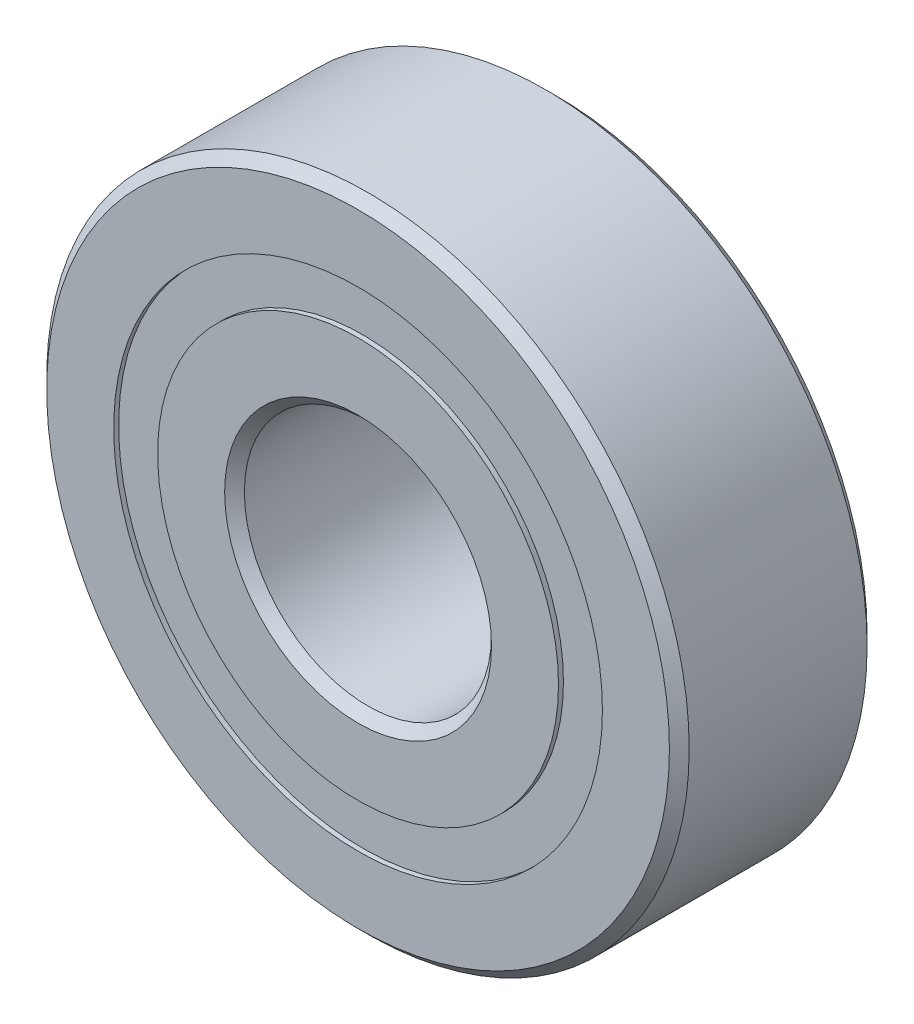
ISO-10303-21;
HEADER;
FILE_DESCRIPTION(('STEP AP214'),'2;1');
FILE_NAME('part.step','',(''),(''),'','','');
FILE_SCHEMA(('AUTOMOTIVE_DESIGN { 1 0 10303 214 1 1 1 1 }'));
ENDSEC;
DATA;
#1=APPLICATION_CONTEXT('core data for automotive mechanical design processes');
#2=APPLICATION_PROTOCOL_DEFINITION('international standard','automotive_design',2000,#1);
#3=PRODUCT_CONTEXT('',#1,'mechanical');
#4=PRODUCT('Part','Part','',(#3));
#5=PRODUCT_RELATED_PRODUCT_CATEGORY('part','',(#4));
#6=PRODUCT_DEFINITION_FORMATION('','',#4);
#7=PRODUCT_DEFINITION_CONTEXT('part definition',#1,'design');
#8=PRODUCT_DEFINITION('design','',#6,#7);
#9=PRODUCT_DEFINITION_SHAPE('','',#8);
#10=(LENGTH_UNIT() NAMED_UNIT(*) SI_UNIT(.MILLI.,.METRE.));
#11=(NAMED_UNIT(*) PLANE_ANGLE_UNIT() SI_UNIT($,.RADIAN.));
#12=(NAMED_UNIT(*) SI_UNIT($,.STERADIAN.) SOLID_ANGLE_UNIT());
#13=UNCERTAINTY_MEASURE_WITH_UNIT(LENGTH_MEASURE(1.E-05),#10,'distance_accuracy_value','');
#14=(GEOMETRIC_REPRESENTATION_CONTEXT(3) GLOBAL_UNCERTAINTY_ASSIGNED_CONTEXT((#13)) GLOBAL_UNIT_ASSIGNED_CONTEXT((#10,
#11,#12)) REPRESENTATION_CONTEXT('',''));
#15=CARTESIAN_POINT('',(0.,0.,0.));
#16=DIRECTION('',(0.,0.,1.));
#17=DIRECTION('',(1.,0.,0.));
#18=AXIS2_PLACEMENT_3D('',#15,#16,#17);
#19=CARTESIAN_POINT('',(0.,4.94444444444444,-0.993807989999908));
#20=DIRECTION('',(0.,0.,-1.));
#21=DIRECTION('',(-1.,0.,0.));
#22=AXIS2_PLACEMENT_3D('',#19,#20,#21);
#23=PLANE('',#22);
#24=CARTESIAN_POINT('',(0.,0.,-0.993807989999909));
#25=DIRECTION('',(0.,0.,1.));
#26=DIRECTION('',(1.,0.,0.));
#27=AXIS2_PLACEMENT_3D('',#24,#25,#26);
#28=CIRCLE('',#27,4.05555555555556);
#29=CARTESIAN_POINT('',(4.05555555555556,0.,-0.993807989999909));
#30=VERTEX_POINT('',#29);
#31=EDGE_CURVE('E11',#30,#30,#28,.T.);
#32=ORIENTED_EDGE('',*,*,#31,.F.);
#33=EDGE_LOOP('',(#32));
#34=FACE_BOUND('',#33,.T.);
#35=CARTESIAN_POINT('',(0.,0.,-0.993807989999908));
#36=DIRECTION('',(0.,0.,1.));
#37=DIRECTION('',(1.,0.,0.));
#38=AXIS2_PLACEMENT_3D('',#35,#36,#37);
#39=CIRCLE('',#38,4.94444444444444);
#40=CARTESIAN_POINT('',(4.94444444444444,0.,-0.993807989999908));
#41=VERTEX_POINT('',#40);
#42=EDGE_CURVE('E55',#41,#41,#39,.T.);
#43=ORIENTED_EDGE('',*,*,#42,.T.);
#44=EDGE_LOOP('',(#43));
#45=FACE_BOUND('',#44,.T.);
#46=ADVANCED_FACE('F41',(#34,#45),#23,.F.);
#47=CARTESIAN_POINT('',(0.,0.,2.));
#48=DIRECTION('',(0.,0.,1.));
#49=DIRECTION('',(1.,0.,0.));
#50=AXIS2_PLACEMENT_3D('',#47,#48,#49);
#51=CYLINDRICAL_SURFACE('',#50,4.05555555555556);
#52=CARTESIAN_POINT('',(0.,0.,-1.9));
#53=DIRECTION('',(0.,0.,1.));
#54=DIRECTION('',(1.,0.,0.));
#55=AXIS2_PLACEMENT_3D('',#52,#53,#54);
#56=CIRCLE('',#55,4.05555555555556);
#57=CARTESIAN_POINT('',(4.05555555555556,0.,-1.9));
#58=VERTEX_POINT('',#57);
#59=EDGE_CURVE('E47',#58,#58,#56,.T.);
#60=ORIENTED_EDGE('',*,*,#59,.F.);
#61=EDGE_LOOP('',(#60));
#62=FACE_BOUND('',#61,.T.);
#63=ORIENTED_EDGE('',*,*,#31,.T.);
#64=EDGE_LOOP('',(#63));
#65=FACE_BOUND('',#64,.T.);
#66=ADVANCED_FACE('F70',(#62,#65),#51,.F.);
#67=CARTESIAN_POINT('',(0.,4.94444444444444,-1.9));
#68=DIRECTION('',(0.,0.,1.));
#69=DIRECTION('',(1.,0.,0.));
#70=AXIS2_PLACEMENT_3D('',#67,#68,#69);
#71=PLANE('',#70);
#72=CARTESIAN_POINT('',(0.,0.,-1.9));
#73=DIRECTION('',(0.,0.,1.));
#74=DIRECTION('',(1.,0.,0.));
#75=AXIS2_PLACEMENT_3D('',#72,#73,#74);
#76=CIRCLE('',#75,4.94444444444444);
#77=CARTESIAN_POINT('',(4.94444444444444,0.,-1.9));
#78=VERTEX_POINT('',#77);
#79=EDGE_CURVE('E51',#78,#78,#76,.T.);
#80=ORIENTED_EDGE('',*,*,#79,.F.);
#81=EDGE_LOOP('',(#80));
#82=FACE_BOUND('',#81,.T.);
#83=ORIENTED_EDGE('',*,*,#59,.T.);
#84=EDGE_LOOP('',(#83));
#85=FACE_BOUND('',#84,.T.);
#86=ADVANCED_FACE('F65',(#82,#85),#71,.F.);
#87=CARTESIAN_POINT('',(0.,0.,2.));
#88=DIRECTION('',(0.,0.,1.));
#89=DIRECTION('',(1.,0.,0.));
#90=AXIS2_PLACEMENT_3D('',#87,#88,#89);
#91=CYLINDRICAL_SURFACE('',#90,4.94444444444444);
#92=ORIENTED_EDGE('',*,*,#42,.F.);
#93=EDGE_LOOP('',(#92));
#94=FACE_BOUND('',#93,.T.);
#95=ORIENTED_EDGE('',*,*,#79,.T.);
#96=EDGE_LOOP('',(#95));
#97=FACE_BOUND('',#96,.T.);
#98=ADVANCED_FACE('F62',(#94,#97),#91,.T.);
#99=CLOSED_SHELL('',(#46,#66,#86,#98));
#100=MANIFOLD_SOLID_BREP('B2',#99);
#101=CARTESIAN_POINT('',(0.,4.94444444444444,1.9));
#102=DIRECTION('',(0.,0.,-1.));
#103=DIRECTION('',(-1.,0.,0.));
#104=AXIS2_PLACEMENT_3D('',#101,#102,#103);
#105=PLANE('',#104);
#106=CARTESIAN_POINT('',(0.,0.,1.9));
#107=DIRECTION('',(0.,0.,1.));
#108=DIRECTION('',(1.,0.,0.));
#109=AXIS2_PLACEMENT_3D('',#106,#107,#108);
#110=CIRCLE('',#109,4.05555555555556);
#111=CARTESIAN_POINT('',(4.05555555555556,0.,1.9));
#112=VERTEX_POINT('',#111);
#113=EDGE_CURVE('E40',#112,#112,#110,.T.);
#114=ORIENTED_EDGE('',*,*,#113,.F.);
#115=EDGE_LOOP('',(#114));
#116=FACE_BOUND('',#115,.T.);
#117=CARTESIAN_POINT('',(0.,0.,1.9));
#118=DIRECTION('',(0.,0.,1.));
#119=DIRECTION('',(1.,0.,0.));
#120=AXIS2_PLACEMENT_3D('',#117,#118,#119);
#121=CIRCLE('',#120,4.94444444444444);
#122=CARTESIAN_POINT('',(4.94444444444444,0.,1.9));
#123=VERTEX_POINT('',#122);
#124=EDGE_CURVE('E122',#123,#123,#121,.T.);
#125=ORIENTED_EDGE('',*,*,#124,.T.);
#126=EDGE_LOOP('',(#125));
#127=FACE_BOUND('',#126,.T.);
#128=ADVANCED_FACE('F108',(#116,#127),#105,.F.);
#129=CARTESIAN_POINT('',(0.,0.,2.));
#130=DIRECTION('',(0.,0.,1.));
#131=DIRECTION('',(1.,0.,0.));
#132=AXIS2_PLACEMENT_3D('',#129,#130,#131);
#133=CYLINDRICAL_SURFACE('',#132,4.05555555555556);
#134=CARTESIAN_POINT('',(0.,0.,0.993807989999903));
#135=DIRECTION('',(0.,0.,1.));
#136=DIRECTION('',(1.,0.,0.));
#137=AXIS2_PLACEMENT_3D('',#134,#135,#136);
#138=CIRCLE('',#137,4.05555555555556);
#139=CARTESIAN_POINT('',(4.05555555555556,0.,0.993807989999903));
#140=VERTEX_POINT('',#139);
#141=EDGE_CURVE('E114',#140,#140,#138,.T.);
#142=ORIENTED_EDGE('',*,*,#141,.F.);
#143=EDGE_LOOP('',(#142));
#144=FACE_BOUND('',#143,.T.);
#145=ORIENTED_EDGE('',*,*,#113,.T.);
#146=EDGE_LOOP('',(#145));
#147=FACE_BOUND('',#146,.T.);
#148=ADVANCED_FACE('F137',(#144,#147),#133,.F.);
#149=CARTESIAN_POINT('',(0.,4.94444444444444,0.993807989999903));
#150=DIRECTION('',(0.,0.,1.));
#151=DIRECTION('',(1.,0.,0.));
#152=AXIS2_PLACEMENT_3D('',#149,#150,#151);
#153=PLANE('',#152);
#154=CARTESIAN_POINT('',(0.,0.,0.993807989999903));
#155=DIRECTION('',(0.,0.,1.));
#156=DIRECTION('',(1.,0.,0.));
#157=AXIS2_PLACEMENT_3D('',#154,#155,#156);
#158=CIRCLE('',#157,4.94444444444444);
#159=CARTESIAN_POINT('',(4.94444444444444,0.,0.993807989999903));
#160=VERTEX_POINT('',#159);
#161=EDGE_CURVE('E118',#160,#160,#158,.T.);
#162=ORIENTED_EDGE('',*,*,#161,.F.);
#163=EDGE_LOOP('',(#162));
#164=FACE_BOUND('',#163,.T.);
#165=ORIENTED_EDGE('',*,*,#141,.T.);
#166=EDGE_LOOP('',(#165));
#167=FACE_BOUND('',#166,.T.);
#168=ADVANCED_FACE('F132',(#164,#167),#153,.F.);
#169=CARTESIAN_POINT('',(0.,0.,2.));
#170=DIRECTION('',(0.,0.,1.));
#171=DIRECTION('',(1.,0.,0.));
#172=AXIS2_PLACEMENT_3D('',#169,#170,#171);
#173=CYLINDRICAL_SURFACE('',#172,4.94444444444444);
#174=ORIENTED_EDGE('',*,*,#124,.F.);
#175=EDGE_LOOP('',(#174));
#176=FACE_BOUND('',#175,.T.);
#177=ORIENTED_EDGE('',*,*,#161,.T.);
#178=EDGE_LOOP('',(#177));
#179=FACE_BOUND('',#178,.T.);
#180=ADVANCED_FACE('F129',(#176,#179),#173,.T.);
#181=CLOSED_SHELL('',(#128,#148,#168,#180));
#182=MANIFOLD_SOLID_BREP('B6',#181);
#183=CARTESIAN_POINT('',(-2.09125427419691,3.98455211543947,0.));
#184=DIRECTION('',(0.,0.,1.));
#185=DIRECTION('',(-0.464723172043757,0.885456025653216,0.));
#186=AXIS2_PLACEMENT_3D('',#183,#184,#185);
#187=SPHERICAL_SURFACE('',#186,0.993807989999902);
#188=CARTESIAN_POINT('',(-2.09125427419691,3.98455211543947,0.993807989999898));
#189=VERTEX_POINT('',#188);
#190=VERTEX_LOOP('',#189);
#191=FACE_BOUND('',#190,.T.);
#192=ADVANCED_FACE('F175',(#191),#187,.T.);
#193=CLOSED_SHELL('',(#192));
#194=MANIFOLD_SOLID_BREP('B35',#193);
#195=CARTESIAN_POINT('',(-3.70342739652142,2.55629136029025,0.));
#196=DIRECTION('',(0.,0.,1.));
#197=DIRECTION('',(-0.822983865893649,0.568064746731166,0.));
#198=AXIS2_PLACEMENT_3D('',#195,#196,#197);
#199=SPHERICAL_SURFACE('',#198,0.993807989999902);
#200=CARTESIAN_POINT('',(-3.70342739652142,2.55629136029025,0.993807989999898));
#201=VERTEX_POINT('',#200);
#202=VERTEX_LOOP('',#201);
#203=FACE_BOUND('',#202,.T.);
#204=ADVANCED_FACE('F206',(#203),#199,.T.);
#205=CLOSED_SHELL('',(#204));
#206=MANIFOLD_SOLID_BREP('B104',#205);
#207=CARTESIAN_POINT('',(-4.46718993344124,0.542415061149002,0.));
#208=DIRECTION('',(0.,0.,1.));
#209=DIRECTION('',(-0.992708874098053,0.120536680255334,0.));
#210=AXIS2_PLACEMENT_3D('',#207,#208,#209);
#211=SPHERICAL_SURFACE('',#210,0.993807989999902);
#212=CARTESIAN_POINT('',(-4.46718993344124,0.542415061149002,0.993807989999898));
#213=VERTEX_POINT('',#212);
#214=VERTEX_LOOP('',#213);
#215=FACE_BOUND('',#214,.T.);
#216=ADVANCED_FACE('F237',(#215),#211,.T.);
#217=CLOSED_SHELL('',(#216));
#218=MANIFOLD_SOLID_BREP('B171',#217);
#219=CARTESIAN_POINT('',(-4.20757309208438,-1.59572199169137,0.));
#220=DIRECTION('',(0.,0.,1.));
#221=DIRECTION('',(-0.935016242685418,-0.354604887042527,0.));
#222=AXIS2_PLACEMENT_3D('',#219,#220,#221);
#223=SPHERICAL_SURFACE('',#222,0.993807989999902);
#224=CARTESIAN_POINT('',(-4.20757309208438,-1.59572199169137,0.993807989999898));
#225=VERTEX_POINT('',#224);
#226=VERTEX_LOOP('',#225);
#227=FACE_BOUND('',#226,.T.);
#228=ADVANCED_FACE('F268',(#227),#223,.T.);
#229=CLOSED_SHELL('',(#228));
#230=MANIFOLD_SOLID_BREP('B202',#229);
#231=CARTESIAN_POINT('',(-2.98405196208361,-3.36829836676993,0.));
#232=DIRECTION('',(0.,0.,1.));
#233=DIRECTION('',(-0.663122658240802,-0.748510748171095,0.));
#234=AXIS2_PLACEMENT_3D('',#231,#232,#233);
#235=SPHERICAL_SURFACE('',#234,0.993807989999902);
#236=CARTESIAN_POINT('',(-2.98405196208361,-3.36829836676993,0.993807989999898));
#237=VERTEX_POINT('',#236);
#238=VERTEX_LOOP('',#237);
#239=FACE_BOUND('',#238,.T.);
#240=ADVANCED_FACE('F299',(#239),#235,.T.);
#241=CLOSED_SHELL('',(#240));
#242=MANIFOLD_SOLID_BREP('B233',#241);
#243=CARTESIAN_POINT('',(-1.07692048929404,-4.36923817841723,0.));
#244=DIRECTION('',(0.,0.,1.));
#245=DIRECTION('',(-0.239315664287565,-0.97094181742605,0.));
#246=AXIS2_PLACEMENT_3D('',#243,#244,#245);
#247=SPHERICAL_SURFACE('',#246,0.993807989999902);
#248=CARTESIAN_POINT('',(-1.07692048929404,-4.36923817841723,0.993807989999898));
#249=VERTEX_POINT('',#248);
#250=VERTEX_LOOP('',#249);
#251=FACE_BOUND('',#250,.T.);
#252=ADVANCED_FACE('F330',(#251),#247,.T.);
#253=CLOSED_SHELL('',(#252));
#254=MANIFOLD_SOLID_BREP('B264',#253);
#255=CARTESIAN_POINT('',(1.07692048929398,-4.36923817841724,0.));
#256=DIRECTION('',(0.,0.,1.));
#257=DIRECTION('',(0.239315664287552,-0.970941817426054,0.));
#258=AXIS2_PLACEMENT_3D('',#255,#256,#257);
#259=SPHERICAL_SURFACE('',#258,0.993807989999902);
#260=CARTESIAN_POINT('',(1.07692048929398,-4.36923817841724,0.993807989999898));
#261=VERTEX_POINT('',#260);
#262=VERTEX_LOOP('',#261);
#263=FACE_BOUND('',#262,.T.);
#264=ADVANCED_FACE('F361',(#263),#259,.T.);
#265=CLOSED_SHELL('',(#264));
#266=MANIFOLD_SOLID_BREP('B295',#265);
#267=CARTESIAN_POINT('',(2.98405196208356,-3.36829836676997,0.));
#268=DIRECTION('',(0.,0.,1.));
#269=DIRECTION('',(0.663122658240791,-0.748510748171105,0.));
#270=AXIS2_PLACEMENT_3D('',#267,#268,#269);
#271=SPHERICAL_SURFACE('',#270,0.993807989999902);
#272=CARTESIAN_POINT('',(2.98405196208356,-3.36829836676997,0.993807989999898));
#273=VERTEX_POINT('',#272);
#274=VERTEX_LOOP('',#273);
#275=FACE_BOUND('',#274,.T.);
#276=ADVANCED_FACE('F392',(#275),#271,.T.);
#277=CLOSED_SHELL('',(#276));
#278=MANIFOLD_SOLID_BREP('B326',#277);
#279=CARTESIAN_POINT('',(4.20757309208436,-1.59572199169143,0.));
#280=DIRECTION('',(0.,0.,1.));
#281=DIRECTION('',(0.935016242685413,-0.35460488704254,0.));
#282=AXIS2_PLACEMENT_3D('',#279,#280,#281);
#283=SPHERICAL_SURFACE('',#282,0.993807989999902);
#284=CARTESIAN_POINT('',(4.20757309208436,-1.59572199169143,0.993807989999898));
#285=VERTEX_POINT('',#284);
#286=VERTEX_LOOP('',#285);
#287=FACE_BOUND('',#286,.T.);
#288=ADVANCED_FACE('F423',(#287),#283,.T.);
#289=CLOSED_SHELL('',(#288));
#290=MANIFOLD_SOLID_BREP('B357',#289);
#291=CARTESIAN_POINT('',(4.46718993344125,0.54241506114894,0.));
#292=DIRECTION('',(0.,0.,1.));
#293=DIRECTION('',(0.992708874098054,0.12053668025532,0.));
#294=AXIS2_PLACEMENT_3D('',#291,#292,#293);
#295=SPHERICAL_SURFACE('',#294,0.993807989999902);
#296=CARTESIAN_POINT('',(4.46718993344125,0.54241506114894,0.993807989999898));
#297=VERTEX_POINT('',#296);
#298=VERTEX_LOOP('',#297);
#299=FACE_BOUND('',#298,.T.);
#300=ADVANCED_FACE('F454',(#299),#295,.T.);
#301=CLOSED_SHELL('',(#300));
#302=MANIFOLD_SOLID_BREP('B388',#301);
#303=CARTESIAN_POINT('',(3.70342739652146,2.55629136029019,0.));
#304=DIRECTION('',(0.,0.,1.));
#305=DIRECTION('',(0.822983865893658,0.568064746731154,0.));
#306=AXIS2_PLACEMENT_3D('',#303,#304,#305);
#307=SPHERICAL_SURFACE('',#306,0.993807989999902);
#308=CARTESIAN_POINT('',(3.70342739652146,2.55629136029019,0.993807989999898));
#309=VERTEX_POINT('',#308);
#310=VERTEX_LOOP('',#309);
#311=FACE_BOUND('',#310,.T.);
#312=ADVANCED_FACE('F485',(#311),#307,.T.);
#313=CLOSED_SHELL('',(#312));
#314=MANIFOLD_SOLID_BREP('B419',#313);
#315=CARTESIAN_POINT('',(2.09125427419696,3.98455211543944,0.));
#316=DIRECTION('',(0.,0.,1.));
#317=DIRECTION('',(0.46472317204377,0.885456025653209,0.));
#318=AXIS2_PLACEMENT_3D('',#315,#316,#317);
#319=SPHERICAL_SURFACE('',#318,0.993807989999902);
#320=CARTESIAN_POINT('',(2.09125427419696,3.98455211543944,0.993807989999898));
#321=VERTEX_POINT('',#320);
#322=VERTEX_LOOP('',#321);
#323=FACE_BOUND('',#322,.T.);
#324=ADVANCED_FACE('F516',(#323),#319,.T.);
#325=CLOSED_SHELL('',(#324));
#326=MANIFOLD_SOLID_BREP('B450',#325);
#327=CARTESIAN_POINT('',(0.,4.5,0.));
#328=DIRECTION('',(0.,0.,1.));
#329=DIRECTION('',(0.,1.,0.));
#330=AXIS2_PLACEMENT_3D('',#327,#328,#329);
#331=SPHERICAL_SURFACE('',#330,0.993807989999902);
#332=CARTESIAN_POINT('',(0.,4.5,0.993807989999898));
#333=VERTEX_POINT('',#332);
#334=VERTEX_LOOP('',#333);
#335=FACE_BOUND('',#334,.T.);
#336=ADVANCED_FACE('F549',(#335),#331,.T.);
#337=CLOSED_SHELL('',(#336));
#338=MANIFOLD_SOLID_BREP('B481',#337);
#339=CARTESIAN_POINT('',(0.,4.05555555555556,2.));
#340=DIRECTION('',(0.,0.,-1.));
#341=DIRECTION('',(-1.,0.,0.));
#342=AXIS2_PLACEMENT_3D('',#339,#340,#341);
#343=PLANE('',#342);
#344=CARTESIAN_POINT('',(0.,0.,2.));
#345=DIRECTION('',(0.,0.,1.));
#346=DIRECTION('',(1.,0.,0.));
#347=AXIS2_PLACEMENT_3D('',#344,#345,#346);
#348=CIRCLE('',#347,2.7);
#349=CARTESIAN_POINT('',(2.7,0.,2.));
#350=VERTEX_POINT('',#349);
#351=EDGE_CURVE('E548',#350,#350,#348,.T.);
#352=ORIENTED_EDGE('',*,*,#351,.F.);
#353=EDGE_LOOP('',(#352));
#354=FACE_BOUND('',#353,.T.);
#355=CARTESIAN_POINT('',(0.,0.,2.));
#356=DIRECTION('',(0.,0.,1.));
#357=DIRECTION('',(1.,0.,0.));
#358=AXIS2_PLACEMENT_3D('',#355,#356,#357);
#359=CIRCLE('',#358,4.05555555555556);
#360=CARTESIAN_POINT('',(4.05555555555556,0.,2.));
#361=VERTEX_POINT('',#360);
#362=EDGE_CURVE('E596',#361,#361,#359,.T.);
#363=ORIENTED_EDGE('',*,*,#362,.T.);
#364=EDGE_LOOP('',(#363));
#365=FACE_BOUND('',#364,.T.);
#366=ADVANCED_FACE('F568',(#354,#365),#343,.F.);
#367=CARTESIAN_POINT('',(0.,0.,2.));
#368=DIRECTION('',(0.,0.,1.));
#369=DIRECTION('',(1.,0.,0.));
#370=AXIS2_PLACEMENT_3D('',#367,#368,#369);
#371=CONICAL_SURFACE('',#370,2.7,0.785398163397448);
#372=CARTESIAN_POINT('',(0.,0.,1.8));
#373=DIRECTION('',(0.,0.,1.));
#374=DIRECTION('',(1.,0.,0.));
#375=AXIS2_PLACEMENT_3D('',#372,#373,#374);
#376=CIRCLE('',#375,2.5);
#377=CARTESIAN_POINT('',(2.5,0.,1.8));
#378=VERTEX_POINT('',#377);
#379=EDGE_CURVE('E574',#378,#378,#376,.T.);
#380=ORIENTED_EDGE('',*,*,#379,.F.);
#381=EDGE_LOOP('',(#380));
#382=FACE_BOUND('',#381,.T.);
#383=ORIENTED_EDGE('',*,*,#351,.T.);
#384=EDGE_LOOP('',(#383));
#385=FACE_BOUND('',#384,.T.);
#386=ADVANCED_FACE('F633',(#382,#385),#371,.F.);
#387=CARTESIAN_POINT('',(0.,0.,2.));
#388=DIRECTION('',(0.,0.,1.));
#389=DIRECTION('',(1.,0.,0.));
#390=AXIS2_PLACEMENT_3D('',#387,#388,#389);
#391=CYLINDRICAL_SURFACE('',#390,2.5);
#392=CARTESIAN_POINT('',(0.,0.,-1.8));
#393=DIRECTION('',(0.,0.,1.));
#394=DIRECTION('',(1.,0.,0.));
#395=AXIS2_PLACEMENT_3D('',#392,#393,#394);
#396=CIRCLE('',#395,2.5);
#397=CARTESIAN_POINT('',(2.5,0.,-1.8));
#398=VERTEX_POINT('',#397);
#399=EDGE_CURVE('E578',#398,#398,#396,.T.);
#400=ORIENTED_EDGE('',*,*,#399,.F.);
#401=EDGE_LOOP('',(#400));
#402=FACE_BOUND('',#401,.T.);
#403=ORIENTED_EDGE('',*,*,#379,.T.);
#404=EDGE_LOOP('',(#403));
#405=FACE_BOUND('',#404,.T.);
#406=ADVANCED_FACE('F628',(#402,#405),#391,.F.);
#407=CARTESIAN_POINT('',(0.,0.,-1.8));
#408=DIRECTION('',(0.,0.,-1.));
#409=DIRECTION('',(-1.,0.,0.));
#410=AXIS2_PLACEMENT_3D('',#407,#408,#409);
#411=CONICAL_SURFACE('',#410,2.5,0.785398163397448);
#412=CARTESIAN_POINT('',(0.,0.,-2.));
#413=DIRECTION('',(0.,0.,1.));
#414=DIRECTION('',(1.,0.,0.));
#415=AXIS2_PLACEMENT_3D('',#412,#413,#414);
#416=CIRCLE('',#415,2.7);
#417=CARTESIAN_POINT('',(2.7,0.,-2.));
#418=VERTEX_POINT('',#417);
#419=EDGE_CURVE('E582',#418,#418,#416,.T.);
#420=ORIENTED_EDGE('',*,*,#419,.F.);
#421=EDGE_LOOP('',(#420));
#422=FACE_BOUND('',#421,.T.);
#423=ORIENTED_EDGE('',*,*,#399,.T.);
#424=EDGE_LOOP('',(#423));
#425=FACE_BOUND('',#424,.T.);
#426=ADVANCED_FACE('F622',(#422,#425),#411,.F.);
#427=CARTESIAN_POINT('',(0.,4.05555555555556,-2.));
#428=DIRECTION('',(0.,0.,1.));
#429=DIRECTION('',(1.,0.,0.));
#430=AXIS2_PLACEMENT_3D('',#427,#428,#429);
#431=PLANE('',#430);
#432=CARTESIAN_POINT('',(0.,0.,-2.00000000000001));
#433=DIRECTION('',(0.,0.,1.));
#434=DIRECTION('',(1.,0.,0.));
#435=AXIS2_PLACEMENT_3D('',#432,#433,#434);
#436=CIRCLE('',#435,4.05555555555556);
#437=CARTESIAN_POINT('',(4.05555555555556,0.,-2.00000000000001));
#438=VERTEX_POINT('',#437);
#439=EDGE_CURVE('E587',#438,#438,#436,.T.);
#440=ORIENTED_EDGE('',*,*,#439,.F.);
#441=EDGE_LOOP('',(#440));
#442=FACE_BOUND('',#441,.T.);
#443=ORIENTED_EDGE('',*,*,#419,.T.);
#444=EDGE_LOOP('',(#443));
#445=FACE_BOUND('',#444,.T.);
#446=ADVANCED_FACE('F616',(#442,#445),#431,.F.);
#447=CARTESIAN_POINT('',(0.,0.,2.));
#448=DIRECTION('',(0.,0.,1.));
#449=DIRECTION('',(1.,0.,0.));
#450=AXIS2_PLACEMENT_3D('',#447,#448,#449);
#451=CYLINDRICAL_SURFACE('',#450,4.05555555555556);
#452=CARTESIAN_POINT('',(0.,0.,-0.88888888888889));
#453=DIRECTION('',(0.,0.,1.));
#454=DIRECTION('',(1.,0.,0.));
#455=AXIS2_PLACEMENT_3D('',#452,#453,#454);
#456=CIRCLE('',#455,4.05555555555556);
#457=CARTESIAN_POINT('',(4.05555555555556,0.,-0.88888888888889));
#458=VERTEX_POINT('',#457);
#459=EDGE_CURVE('E590',#458,#458,#456,.T.);
#460=ORIENTED_EDGE('',*,*,#459,.F.);
#461=EDGE_LOOP('',(#460));
#462=FACE_BOUND('',#461,.T.);
#463=ORIENTED_EDGE('',*,*,#439,.T.);
#464=EDGE_LOOP('',(#463));
#465=FACE_BOUND('',#464,.T.);
#466=ADVANCED_FACE('F610',(#462,#465),#451,.T.);
#467=CARTESIAN_POINT('',(0.,0.,0.));
#468=DIRECTION('',(0.,0.,1.));
#469=DIRECTION('',(1.,0.,0.));
#470=AXIS2_PLACEMENT_3D('',#467,#468,#469);
#471=TOROIDAL_SURFACE('',#470,4.5,0.993807989999904);
#472=CARTESIAN_POINT('',(0.,0.,0.888888888888885));
#473=DIRECTION('',(0.,0.,1.));
#474=DIRECTION('',(1.,0.,0.));
#475=AXIS2_PLACEMENT_3D('',#472,#473,#474);
#476=CIRCLE('',#475,4.05555555555556);
#477=CARTESIAN_POINT('',(4.05555555555556,0.,0.888888888888885));
#478=VERTEX_POINT('',#477);
#479=EDGE_CURVE('E593',#478,#478,#476,.T.);
#480=ORIENTED_EDGE('',*,*,#479,.F.);
#481=EDGE_LOOP('',(#480));
#482=FACE_BOUND('',#481,.T.);
#483=ORIENTED_EDGE('',*,*,#459,.T.);
#484=EDGE_LOOP('',(#483));
#485=FACE_BOUND('',#484,.T.);
#486=ADVANCED_FACE('F604',(#482,#485),#471,.F.);
#487=CARTESIAN_POINT('',(0.,0.,2.));
#488=DIRECTION('',(0.,0.,1.));
#489=DIRECTION('',(1.,0.,0.));
#490=AXIS2_PLACEMENT_3D('',#487,#488,#489);
#491=CYLINDRICAL_SURFACE('',#490,4.05555555555556);
#492=ORIENTED_EDGE('',*,*,#362,.F.);
#493=EDGE_LOOP('',(#492));
#494=FACE_BOUND('',#493,.T.);
#495=ORIENTED_EDGE('',*,*,#479,.T.);
#496=EDGE_LOOP('',(#495));
#497=FACE_BOUND('',#496,.T.);
#498=ADVANCED_FACE('F601',(#494,#497),#491,.T.);
#499=CLOSED_SHELL('',(#366,#386,#406,#426,#446,#466,#486,#498));
#500=MANIFOLD_SOLID_BREP('B512',#499);
#501=CARTESIAN_POINT('',(0.,0.,1.8));
#502=DIRECTION('',(0.,0.,-1.));
#503=DIRECTION('',(-1.,0.,0.));
#504=AXIS2_PLACEMENT_3D('',#501,#502,#503);
#505=CONICAL_SURFACE('',#504,6.5,0.785398163397446);
#506=CARTESIAN_POINT('',(0.,0.,2.));
#507=DIRECTION('',(0.,0.,1.));
#508=DIRECTION('',(1.,0.,0.));
#509=AXIS2_PLACEMENT_3D('',#506,#507,#508);
#510=CIRCLE('',#509,6.3);
#511=CARTESIAN_POINT('',(6.3,0.,2.));
#512=VERTEX_POINT('',#511);
#513=EDGE_CURVE('E717',#512,#512,#510,.T.);
#514=ORIENTED_EDGE('',*,*,#513,.F.);
#515=EDGE_LOOP('',(#514));
#516=FACE_BOUND('',#515,.T.);
#517=CARTESIAN_POINT('',(0.,0.,1.8));
#518=DIRECTION('',(0.,0.,1.));
#519=DIRECTION('',(1.,0.,0.));
#520=AXIS2_PLACEMENT_3D('',#517,#518,#519);
#521=CIRCLE('',#520,6.5);
#522=CARTESIAN_POINT('',(6.5,0.,1.8));
#523=VERTEX_POINT('',#522);
#524=EDGE_CURVE('E567',#523,#523,#521,.T.);
#525=ORIENTED_EDGE('',*,*,#524,.T.);
#526=EDGE_LOOP('',(#525));
#527=FACE_BOUND('',#526,.T.);
#528=ADVANCED_FACE('F689',(#516,#527),#505,.T.);
#529=CARTESIAN_POINT('',(0.,0.,2.));
#530=DIRECTION('',(0.,0.,1.));
#531=DIRECTION('',(1.,0.,0.));
#532=AXIS2_PLACEMENT_3D('',#529,#530,#531);
#533=CYLINDRICAL_SURFACE('',#532,6.5);
#534=ORIENTED_EDGE('',*,*,#524,.F.);
#535=EDGE_LOOP('',(#534));
#536=FACE_BOUND('',#535,.T.);
#537=CARTESIAN_POINT('',(0.,0.,-1.80000000000001));
#538=DIRECTION('',(0.,0.,1.));
#539=DIRECTION('',(1.,0.,0.));
#540=AXIS2_PLACEMENT_3D('',#537,#538,#539);
#541=CIRCLE('',#540,6.5);
#542=CARTESIAN_POINT('',(6.5,0.,-1.80000000000001));
#543=VERTEX_POINT('',#542);
#544=EDGE_CURVE('E695',#543,#543,#541,.T.);
#545=ORIENTED_EDGE('',*,*,#544,.T.);
#546=EDGE_LOOP('',(#545));
#547=FACE_BOUND('',#546,.T.);
#548=ADVANCED_FACE('F724',(#536,#547),#533,.T.);
#549=CARTESIAN_POINT('',(0.,0.,-2.00000000000001));
#550=DIRECTION('',(0.,0.,1.));
#551=DIRECTION('',(1.,0.,0.));
#552=AXIS2_PLACEMENT_3D('',#549,#550,#551);
#553=CONICAL_SURFACE('',#552,6.3,0.785398163397448);
#554=ORIENTED_EDGE('',*,*,#544,.F.);
#555=EDGE_LOOP('',(#554));
#556=FACE_BOUND('',#555,.T.);
#557=CARTESIAN_POINT('',(0.,0.,-2.00000000000001));
#558=DIRECTION('',(0.,0.,1.));
#559=DIRECTION('',(1.,0.,0.));
#560=AXIS2_PLACEMENT_3D('',#557,#558,#559);
#561=CIRCLE('',#560,6.3);
#562=CARTESIAN_POINT('',(6.3,0.,-2.00000000000001));
#563=VERTEX_POINT('',#562);
#564=EDGE_CURVE('E699',#563,#563,#561,.T.);
#565=ORIENTED_EDGE('',*,*,#564,.T.);
#566=EDGE_LOOP('',(#565));
#567=FACE_BOUND('',#566,.T.);
#568=ADVANCED_FACE('F728',(#556,#567),#553,.T.);
#569=CARTESIAN_POINT('',(0.,6.3,-2.00000000000001));
#570=DIRECTION('',(0.,0.,1.));
#571=DIRECTION('',(1.,0.,0.));
#572=AXIS2_PLACEMENT_3D('',#569,#570,#571);
#573=PLANE('',#572);
#574=ORIENTED_EDGE('',*,*,#564,.F.);
#575=EDGE_LOOP('',(#574));
#576=FACE_BOUND('',#575,.T.);
#577=CARTESIAN_POINT('',(0.,0.,-2.00000000000001));
#578=DIRECTION('',(0.,0.,1.));
#579=DIRECTION('',(1.,0.,0.));
#580=AXIS2_PLACEMENT_3D('',#577,#578,#579);
#581=CIRCLE('',#580,4.94444444444444);
#582=CARTESIAN_POINT('',(4.94444444444444,0.,-2.00000000000001));
#583=VERTEX_POINT('',#582);
#584=EDGE_CURVE('E703',#583,#583,#581,.T.);
#585=ORIENTED_EDGE('',*,*,#584,.T.);
#586=EDGE_LOOP('',(#585));
#587=FACE_BOUND('',#586,.T.);
#588=ADVANCED_FACE('F733',(#576,#587),#573,.F.);
#589=CARTESIAN_POINT('',(0.,0.,2.));
#590=DIRECTION('',(0.,0.,1.));
#591=DIRECTION('',(1.,0.,0.));
#592=AXIS2_PLACEMENT_3D('',#589,#590,#591);
#593=CYLINDRICAL_SURFACE('',#592,4.94444444444444);
#594=ORIENTED_EDGE('',*,*,#584,.F.);
#595=EDGE_LOOP('',(#594));
#596=FACE_BOUND('',#595,.T.);
#597=CARTESIAN_POINT('',(0.,0.,-0.888888888888893));
#598=DIRECTION('',(0.,0.,1.));
#599=DIRECTION('',(1.,0.,0.));
#600=AXIS2_PLACEMENT_3D('',#597,#598,#599);
#601=CIRCLE('',#600,4.94444444444444);
#602=CARTESIAN_POINT('',(4.94444444444444,0.,-0.888888888888893));
#603=VERTEX_POINT('',#602);
#604=EDGE_CURVE('E708',#603,#603,#601,.T.);
#605=ORIENTED_EDGE('',*,*,#604,.T.);
#606=EDGE_LOOP('',(#605));
#607=FACE_BOUND('',#606,.T.);
#608=ADVANCED_FACE('F739',(#596,#607),#593,.F.);
#609=CARTESIAN_POINT('',(0.,0.,0.));
#610=DIRECTION('',(0.,0.,1.));
#611=DIRECTION('',(1.,0.,0.));
#612=AXIS2_PLACEMENT_3D('',#609,#610,#611);
#613=TOROIDAL_SURFACE('',#612,4.5,0.993807989999905);
#614=ORIENTED_EDGE('',*,*,#604,.F.);
#615=EDGE_LOOP('',(#614));
#616=FACE_BOUND('',#615,.T.);
#617=CARTESIAN_POINT('',(0.,0.,0.888888888888885));
#618=DIRECTION('',(0.,0.,1.));
#619=DIRECTION('',(1.,0.,0.));
#620=AXIS2_PLACEMENT_3D('',#617,#618,#619);
#621=CIRCLE('',#620,4.94444444444444);
#622=CARTESIAN_POINT('',(4.94444444444444,0.,0.888888888888885));
#623=VERTEX_POINT('',#622);
#624=EDGE_CURVE('E711',#623,#623,#621,.T.);
#625=ORIENTED_EDGE('',*,*,#624,.T.);
#626=EDGE_LOOP('',(#625));
#627=FACE_BOUND('',#626,.T.);
#628=ADVANCED_FACE('F743',(#616,#627),#613,.F.);
#629=CARTESIAN_POINT('',(0.,0.,2.));
#630=DIRECTION('',(0.,0.,1.));
#631=DIRECTION('',(1.,0.,0.));
#632=AXIS2_PLACEMENT_3D('',#629,#630,#631);
#633=CYLINDRICAL_SURFACE('',#632,4.94444444444444);
#634=ORIENTED_EDGE('',*,*,#624,.F.);
#635=EDGE_LOOP('',(#634));
#636=FACE_BOUND('',#635,.T.);
#637=CARTESIAN_POINT('',(0.,0.,2.));
#638=DIRECTION('',(0.,0.,1.));
#639=DIRECTION('',(1.,0.,0.));
#640=AXIS2_PLACEMENT_3D('',#637,#638,#639);
#641=CIRCLE('',#640,4.94444444444444);
#642=CARTESIAN_POINT('',(4.94444444444444,0.,2.));
#643=VERTEX_POINT('',#642);
#644=EDGE_CURVE('E714',#643,#643,#641,.T.);
#645=ORIENTED_EDGE('',*,*,#644,.T.);
#646=EDGE_LOOP('',(#645));
#647=FACE_BOUND('',#646,.T.);
#648=ADVANCED_FACE('F747',(#636,#647),#633,.F.);
#649=CARTESIAN_POINT('',(0.,6.3,2.));
#650=DIRECTION('',(0.,0.,-1.));
#651=DIRECTION('',(-1.,0.,0.));
#652=AXIS2_PLACEMENT_3D('',#649,#650,#651);
#653=PLANE('',#652);
#654=ORIENTED_EDGE('',*,*,#644,.F.);
#655=EDGE_LOOP('',(#654));
#656=FACE_BOUND('',#655,.T.);
#657=ORIENTED_EDGE('',*,*,#513,.T.);
#658=EDGE_LOOP('',(#657));
#659=FACE_BOUND('',#658,.T.);
#660=ADVANCED_FACE('F721',(#656,#659),#653,.F.);
#661=CLOSED_SHELL('',(#528,#548,#568,#588,#608,#628,#648,#660));
#662=MANIFOLD_SOLID_BREP('B543',#661);
#663=ADVANCED_BREP_SHAPE_REPRESENTATION('',(#18,#100,#182,#194,#206,#218,#230,#242,#254,#266,
#278,#290,#302,#314,#326,#338,#500,#662),#14);
#664=SHAPE_DEFINITION_REPRESENTATION(#9,#663);
ENDSEC;
END-ISO-10303-21;
